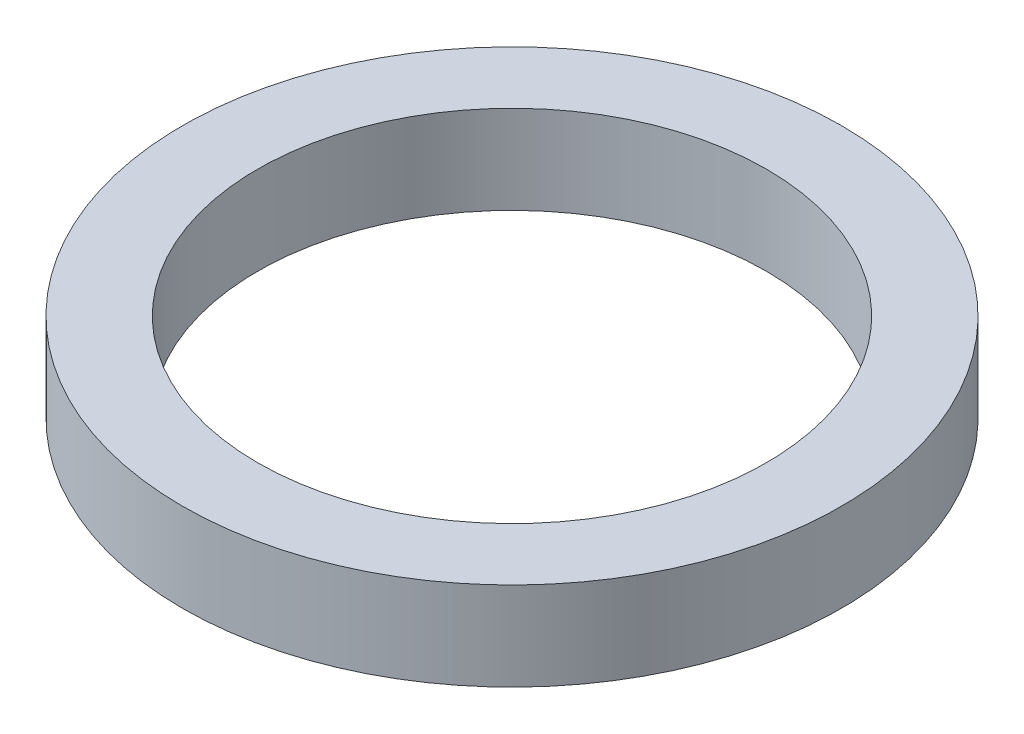
ISO-10303-21;
HEADER;
FILE_DESCRIPTION(('STEP AP214'),'2;1');
FILE_NAME('part.step','',(''),(''),'','','');
FILE_SCHEMA(('AUTOMOTIVE_DESIGN { 1 0 10303 214 1 1 1 1 }'));
ENDSEC;
DATA;
#1=APPLICATION_CONTEXT('core data for automotive mechanical design processes');
#2=APPLICATION_PROTOCOL_DEFINITION('international standard','automotive_design',2000,#1);
#3=PRODUCT_CONTEXT('',#1,'mechanical');
#4=PRODUCT('Part','Part','',(#3));
#5=PRODUCT_RELATED_PRODUCT_CATEGORY('part','',(#4));
#6=PRODUCT_DEFINITION_FORMATION('','',#4);
#7=PRODUCT_DEFINITION_CONTEXT('part definition',#1,'design');
#8=PRODUCT_DEFINITION('design','',#6,#7);
#9=PRODUCT_DEFINITION_SHAPE('','',#8);
#10=(LENGTH_UNIT() NAMED_UNIT(*) SI_UNIT(.MILLI.,.METRE.));
#11=(NAMED_UNIT(*) PLANE_ANGLE_UNIT() SI_UNIT($,.RADIAN.));
#12=(NAMED_UNIT(*) SI_UNIT($,.STERADIAN.) SOLID_ANGLE_UNIT());
#13=UNCERTAINTY_MEASURE_WITH_UNIT(LENGTH_MEASURE(1.E-05),#10,'distance_accuracy_value','');
#14=(GEOMETRIC_REPRESENTATION_CONTEXT(3) GLOBAL_UNCERTAINTY_ASSIGNED_CONTEXT((#13)) GLOBAL_UNIT_ASSIGNED_CONTEXT((#10,
#11,#12)) REPRESENTATION_CONTEXT('',''));
#15=CARTESIAN_POINT('',(0.,0.,0.));
#16=DIRECTION('',(0.,0.,1.));
#17=DIRECTION('',(1.,0.,0.));
#18=AXIS2_PLACEMENT_3D('',#15,#16,#17);
#19=CARTESIAN_POINT('',(0.,2.,0.));
#20=DIRECTION('',(0.,1.,0.));
#21=DIRECTION('',(0.,0.,1.));
#22=AXIS2_PLACEMENT_3D('',#19,#20,#21);
#23=PLANE('',#22);
#24=CARTESIAN_POINT('',(0.,2.,0.));
#25=DIRECTION('',(0.,1.,0.));
#26=DIRECTION('',(0.,0.,1.));
#27=AXIS2_PLACEMENT_3D('',#24,#25,#26);
#28=CIRCLE('',#27,7.45);
#29=CARTESIAN_POINT('',(0.,2.,7.45));
#30=VERTEX_POINT('',#29);
#31=EDGE_CURVE('E10',#30,#30,#28,.T.);
#32=ORIENTED_EDGE('',*,*,#31,.T.);
#33=EDGE_LOOP('',(#32));
#34=FACE_BOUND('',#33,.T.);
#35=CARTESIAN_POINT('',(0.,2.,0.));
#36=DIRECTION('',(0.,1.,0.));
#37=DIRECTION('',(0.,0.,1.));
#38=AXIS2_PLACEMENT_3D('',#35,#36,#37);
#39=CIRCLE('',#38,5.75);
#40=CARTESIAN_POINT('',(0.,2.,5.75));
#41=VERTEX_POINT('',#40);
#42=EDGE_CURVE('E54',#41,#41,#39,.T.);
#43=ORIENTED_EDGE('',*,*,#42,.F.);
#44=EDGE_LOOP('',(#43));
#45=FACE_BOUND('',#44,.T.);
#46=ADVANCED_FACE('F41',(#34,#45),#23,.T.);
#47=CARTESIAN_POINT('',(0.,0.,0.));
#48=DIRECTION('',(0.,1.,0.));
#49=DIRECTION('',(0.,0.,1.));
#50=AXIS2_PLACEMENT_3D('',#47,#48,#49);
#51=PLANE('',#50);
#52=CARTESIAN_POINT('',(0.,0.,0.));
#53=DIRECTION('',(0.,1.,0.));
#54=DIRECTION('',(0.,0.,1.));
#55=AXIS2_PLACEMENT_3D('',#52,#53,#54);
#56=CIRCLE('',#55,7.45);
#57=CARTESIAN_POINT('',(0.,0.,7.45));
#58=VERTEX_POINT('',#57);
#59=EDGE_CURVE('E45',#58,#58,#56,.T.);
#60=ORIENTED_EDGE('',*,*,#59,.F.);
#61=EDGE_LOOP('',(#60));
#62=FACE_BOUND('',#61,.T.);
#63=CARTESIAN_POINT('',(0.,0.,0.));
#64=DIRECTION('',(0.,1.,0.));
#65=DIRECTION('',(0.,0.,1.));
#66=AXIS2_PLACEMENT_3D('',#63,#64,#65);
#67=CIRCLE('',#66,5.75);
#68=CARTESIAN_POINT('',(0.,0.,5.75));
#69=VERTEX_POINT('',#68);
#70=EDGE_CURVE('E56',#69,#69,#67,.T.);
#71=ORIENTED_EDGE('',*,*,#70,.T.);
#72=EDGE_LOOP('',(#71));
#73=FACE_BOUND('',#72,.T.);
#74=ADVANCED_FACE('F68',(#62,#73),#51,.F.);
#75=CARTESIAN_POINT('',(0.,2.,0.));
#76=DIRECTION('',(0.,-1.,0.));
#77=DIRECTION('',(0.,0.,-1.));
#78=AXIS2_PLACEMENT_3D('',#75,#76,#77);
#79=CYLINDRICAL_SURFACE('',#78,7.45);
#80=ORIENTED_EDGE('',*,*,#31,.F.);
#81=EDGE_LOOP('',(#80));
#82=FACE_BOUND('',#81,.T.);
#83=ORIENTED_EDGE('',*,*,#59,.T.);
#84=EDGE_LOOP('',(#83));
#85=FACE_BOUND('',#84,.T.);
#86=ADVANCED_FACE('F43',(#82,#85),#79,.T.);
#87=CARTESIAN_POINT('',(0.,2.,0.));
#88=DIRECTION('',(0.,-1.,0.));
#89=DIRECTION('',(0.,0.,-1.));
#90=AXIS2_PLACEMENT_3D('',#87,#88,#89);
#91=CYLINDRICAL_SURFACE('',#90,5.75);
#92=ORIENTED_EDGE('',*,*,#42,.T.);
#93=EDGE_LOOP('',(#92));
#94=FACE_BOUND('',#93,.T.);
#95=ORIENTED_EDGE('',*,*,#70,.F.);
#96=EDGE_LOOP('',(#95));
#97=FACE_BOUND('',#96,.T.);
#98=ADVANCED_FACE('F64',(#94,#97),#91,.F.);
#99=CLOSED_SHELL('',(#46,#74,#86,#98));
#100=MANIFOLD_SOLID_BREP('B2',#99);
#101=ADVANCED_BREP_SHAPE_REPRESENTATION('',(#18,#100),#14);
#102=SHAPE_DEFINITION_REPRESENTATION(#9,#101);
ENDSEC;
END-ISO-10303-21;
